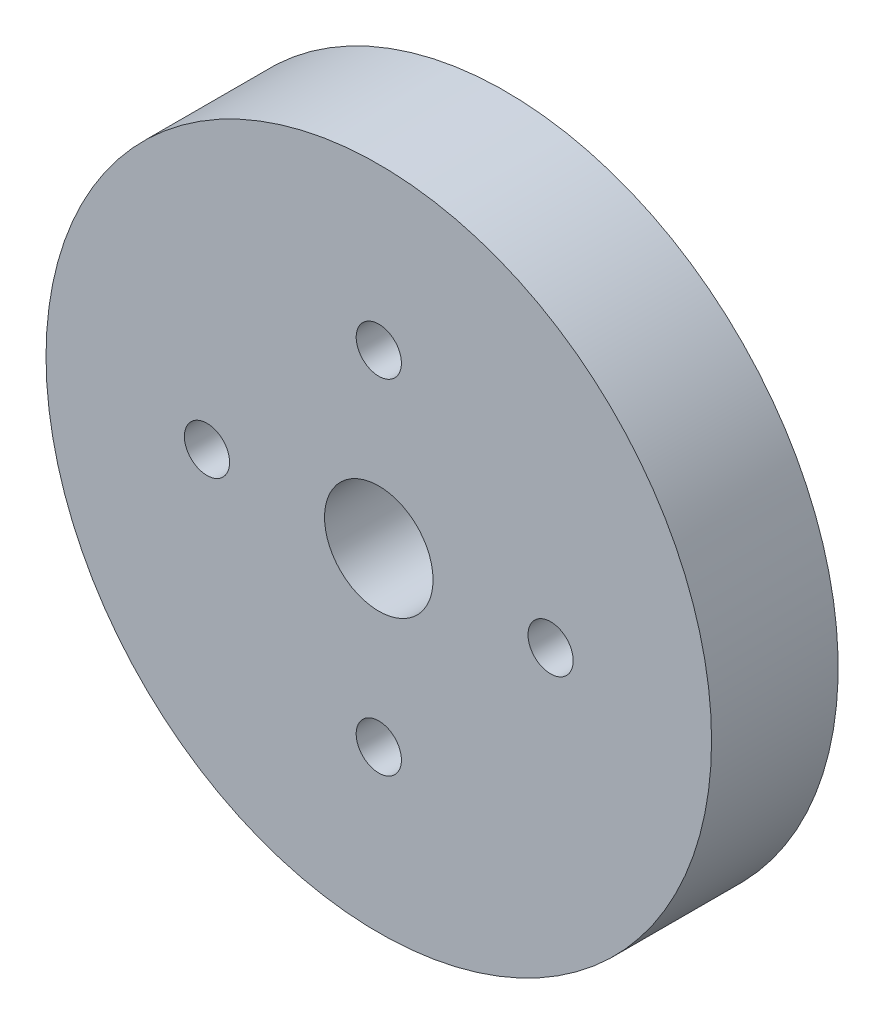
ISO-10303-21;
HEADER;
FILE_DESCRIPTION(('STEP AP214'),'2;1');
FILE_NAME('part.step','',(''),(''),'','','');
FILE_SCHEMA(('AUTOMOTIVE_DESIGN { 1 0 10303 214 1 1 1 1 }'));
ENDSEC;
DATA;
#1=APPLICATION_CONTEXT('core data for automotive mechanical design processes');
#2=APPLICATION_PROTOCOL_DEFINITION('international standard','automotive_design',2000,#1);
#3=PRODUCT_CONTEXT('',#1,'mechanical');
#4=PRODUCT('Part','Part','',(#3));
#5=PRODUCT_RELATED_PRODUCT_CATEGORY('part','',(#4));
#6=PRODUCT_DEFINITION_FORMATION('','',#4);
#7=PRODUCT_DEFINITION_CONTEXT('part definition',#1,'design');
#8=PRODUCT_DEFINITION('design','',#6,#7);
#9=PRODUCT_DEFINITION_SHAPE('','',#8);
#10=(LENGTH_UNIT() NAMED_UNIT(*) SI_UNIT(.MILLI.,.METRE.));
#11=(NAMED_UNIT(*) PLANE_ANGLE_UNIT() SI_UNIT($,.RADIAN.));
#12=(NAMED_UNIT(*) SI_UNIT($,.STERADIAN.) SOLID_ANGLE_UNIT());
#13=UNCERTAINTY_MEASURE_WITH_UNIT(LENGTH_MEASURE(1.E-05),#10,'distance_accuracy_value','');
#14=(GEOMETRIC_REPRESENTATION_CONTEXT(3) GLOBAL_UNCERTAINTY_ASSIGNED_CONTEXT((#13)) GLOBAL_UNIT_ASSIGNED_CONTEXT((#10,
#11,#12)) REPRESENTATION_CONTEXT('',''));
#15=CARTESIAN_POINT('',(0.,0.,0.));
#16=DIRECTION('',(0.,0.,1.));
#17=DIRECTION('',(1.,0.,0.));
#18=AXIS2_PLACEMENT_3D('',#15,#16,#17);
#19=CARTESIAN_POINT('',(0.,0.,26.3));
#20=DIRECTION('',(0.,0.,-1.));
#21=DIRECTION('',(-1.,0.,0.));
#22=AXIS2_PLACEMENT_3D('',#19,#20,#21);
#23=CYLINDRICAL_SURFACE('',#22,18.4);
#24=CARTESIAN_POINT('',(0.,0.,26.3));
#25=DIRECTION('',(0.,0.,1.));
#26=DIRECTION('',(1.,0.,0.));
#27=AXIS2_PLACEMENT_3D('',#24,#25,#26);
#28=CIRCLE('',#27,18.4);
#29=CARTESIAN_POINT('',(18.4,0.,26.3));
#30=VERTEX_POINT('',#29);
#31=EDGE_CURVE('E10',#30,#30,#28,.T.);
#32=ORIENTED_EDGE('',*,*,#31,.F.);
#33=EDGE_LOOP('',(#32));
#34=FACE_BOUND('',#33,.T.);
#35=CARTESIAN_POINT('',(0.,0.,19.3));
#36=DIRECTION('',(0.,0.,-1.));
#37=DIRECTION('',(-1.,0.,0.));
#38=AXIS2_PLACEMENT_3D('',#35,#36,#37);
#39=CIRCLE('',#38,18.4);
#40=CARTESIAN_POINT('',(-18.4,0.,19.3));
#41=VERTEX_POINT('',#40);
#42=EDGE_CURVE('E68',#41,#41,#39,.T.);
#43=ORIENTED_EDGE('',*,*,#42,.F.);
#44=EDGE_LOOP('',(#43));
#45=FACE_BOUND('',#44,.T.);
#46=ADVANCED_FACE('F35',(#34,#45),#23,.T.);
#47=CARTESIAN_POINT('',(0.,0.,26.3));
#48=DIRECTION('',(0.,0.,1.));
#49=DIRECTION('',(1.,0.,0.));
#50=AXIS2_PLACEMENT_3D('',#47,#48,#49);
#51=PLANE('',#50);
#52=CARTESIAN_POINT('',(0.,9.5,26.3));
#53=DIRECTION('',(0.,0.,1.));
#54=DIRECTION('',(1.,0.,0.));
#55=AXIS2_PLACEMENT_3D('',#52,#53,#54);
#56=CIRCLE('',#55,1.25);
#57=CARTESIAN_POINT('',(1.25,9.5,26.3));
#58=VERTEX_POINT('',#57);
#59=EDGE_CURVE('E59',#58,#58,#56,.T.);
#60=ORIENTED_EDGE('',*,*,#59,.F.);
#61=EDGE_LOOP('',(#60));
#62=FACE_BOUND('',#61,.T.);
#63=CARTESIAN_POINT('',(9.50000000000027,2.68842825129648E-13,26.3));
#64=DIRECTION('',(0.,0.,1.));
#65=DIRECTION('',(1.,0.,0.));
#66=AXIS2_PLACEMENT_3D('',#63,#64,#65);
#67=CIRCLE('',#66,1.25000000000021);
#68=CARTESIAN_POINT('',(10.7500000000005,2.68842825129648E-13,26.3));
#69=VERTEX_POINT('',#68);
#70=EDGE_CURVE('E52',#69,#69,#67,.T.);
#71=ORIENTED_EDGE('',*,*,#70,.F.);
#72=EDGE_LOOP('',(#71));
#73=FACE_BOUND('',#72,.T.);
#74=CARTESIAN_POINT('',(5.37685650259296E-13,-9.5,26.3));
#75=DIRECTION('',(0.,0.,1.));
#76=DIRECTION('',(1.,0.,0.));
#77=AXIS2_PLACEMENT_3D('',#74,#75,#76);
#78=CIRCLE('',#77,1.25000000000058);
#79=CARTESIAN_POINT('',(1.25000000000112,-9.5,26.3));
#80=VERTEX_POINT('',#79);
#81=EDGE_CURVE('E71',#80,#80,#78,.T.);
#82=ORIENTED_EDGE('',*,*,#81,.F.);
#83=EDGE_LOOP('',(#82));
#84=FACE_BOUND('',#83,.T.);
#85=CARTESIAN_POINT('',(-9.49999999999973,-2.70006239588838E-13,26.3));
#86=DIRECTION('',(0.,0.,1.));
#87=DIRECTION('',(1.,0.,0.));
#88=AXIS2_PLACEMENT_3D('',#85,#86,#87);
#89=CIRCLE('',#88,1.25000000000043);
#90=CARTESIAN_POINT('',(-8.2499999999993,-2.70006239588838E-13,26.3));
#91=VERTEX_POINT('',#90);
#92=EDGE_CURVE('E64',#91,#91,#89,.T.);
#93=ORIENTED_EDGE('',*,*,#92,.F.);
#94=EDGE_LOOP('',(#93));
#95=FACE_BOUND('',#94,.T.);
#96=CARTESIAN_POINT('',(0.,0.,26.3));
#97=DIRECTION('',(0.,0.,1.));
#98=DIRECTION('',(1.,0.,0.));
#99=AXIS2_PLACEMENT_3D('',#96,#97,#98);
#100=CIRCLE('',#99,3.);
#101=CARTESIAN_POINT('',(3.,0.,26.3));
#102=VERTEX_POINT('',#101);
#103=EDGE_CURVE('E45',#102,#102,#100,.T.);
#104=ORIENTED_EDGE('',*,*,#103,.F.);
#105=EDGE_LOOP('',(#104));
#106=FACE_BOUND('',#105,.T.);
#107=ORIENTED_EDGE('',*,*,#31,.T.);
#108=EDGE_LOOP('',(#107));
#109=FACE_BOUND('',#108,.T.);
#110=ADVANCED_FACE('F101',(#62,#73,#84,#95,#106,#109),#51,.T.);
#111=CARTESIAN_POINT('',(0.,0.,21.3));
#112=DIRECTION('',(0.,0.,1.));
#113=DIRECTION('',(1.,0.,0.));
#114=AXIS2_PLACEMENT_3D('',#111,#112,#113);
#115=CYLINDRICAL_SURFACE('',#114,3.);
#116=CARTESIAN_POINT('',(0.,0.,21.3));
#117=DIRECTION('',(0.,0.,1.));
#118=DIRECTION('',(1.,0.,0.));
#119=AXIS2_PLACEMENT_3D('',#116,#117,#118);
#120=CIRCLE('',#119,3.);
#121=CARTESIAN_POINT('',(3.,0.,21.3));
#122=VERTEX_POINT('',#121);
#123=EDGE_CURVE('E41',#122,#122,#120,.T.);
#124=ORIENTED_EDGE('',*,*,#123,.F.);
#125=EDGE_LOOP('',(#124));
#126=FACE_BOUND('',#125,.T.);
#127=ORIENTED_EDGE('',*,*,#103,.T.);
#128=EDGE_LOOP('',(#127));
#129=FACE_BOUND('',#128,.T.);
#130=ADVANCED_FACE('F106',(#126,#129),#115,.F.);
#131=CARTESIAN_POINT('',(0.,0.,21.3));
#132=DIRECTION('',(0.,0.,1.));
#133=DIRECTION('',(1.,0.,0.));
#134=AXIS2_PLACEMENT_3D('',#131,#132,#133);
#135=PLANE('',#134);
#136=ORIENTED_EDGE('',*,*,#123,.T.);
#137=EDGE_LOOP('',(#136));
#138=FACE_BOUND('',#137,.T.);
#139=ADVANCED_FACE('F111',(#138),#135,.T.);
#140=CARTESIAN_POINT('',(-9.49999999999973,-2.70006239588838E-13,21.3));
#141=DIRECTION('',(0.,0.,1.));
#142=DIRECTION('',(1.,0.,0.));
#143=AXIS2_PLACEMENT_3D('',#140,#141,#142);
#144=CYLINDRICAL_SURFACE('',#143,1.25000000000043);
#145=CARTESIAN_POINT('',(-9.49999999999973,-2.70006239588838E-13,21.3));
#146=DIRECTION('',(0.,0.,1.));
#147=DIRECTION('',(1.,0.,0.));
#148=AXIS2_PLACEMENT_3D('',#145,#146,#147);
#149=CIRCLE('',#148,1.25000000000043);
#150=CARTESIAN_POINT('',(-8.2499999999993,-2.70006239588838E-13,21.3));
#151=VERTEX_POINT('',#150);
#152=EDGE_CURVE('E67',#151,#151,#149,.T.);
#153=ORIENTED_EDGE('',*,*,#152,.F.);
#154=EDGE_LOOP('',(#153));
#155=FACE_BOUND('',#154,.T.);
#156=ORIENTED_EDGE('',*,*,#92,.T.);
#157=EDGE_LOOP('',(#156));
#158=FACE_BOUND('',#157,.T.);
#159=ADVANCED_FACE('F119',(#155,#158),#144,.F.);
#160=CARTESIAN_POINT('',(-9.49999999999973,-2.70006239588838E-13,21.3));
#161=DIRECTION('',(0.,0.,1.));
#162=DIRECTION('',(1.,0.,0.));
#163=AXIS2_PLACEMENT_3D('',#160,#161,#162);
#164=PLANE('',#163);
#165=ORIENTED_EDGE('',*,*,#152,.T.);
#166=EDGE_LOOP('',(#165));
#167=FACE_BOUND('',#166,.T.);
#168=ADVANCED_FACE('F138',(#167),#164,.T.);
#169=CARTESIAN_POINT('',(5.37685650259296E-13,-9.5,21.3));
#170=DIRECTION('',(0.,0.,1.));
#171=DIRECTION('',(1.,0.,0.));
#172=AXIS2_PLACEMENT_3D('',#169,#170,#171);
#173=CYLINDRICAL_SURFACE('',#172,1.25000000000058);
#174=CARTESIAN_POINT('',(5.37685650259296E-13,-9.5,21.3));
#175=DIRECTION('',(0.,0.,1.));
#176=DIRECTION('',(1.,0.,0.));
#177=AXIS2_PLACEMENT_3D('',#174,#175,#176);
#178=CIRCLE('',#177,1.25000000000058);
#179=CARTESIAN_POINT('',(1.25000000000112,-9.5,21.3));
#180=VERTEX_POINT('',#179);
#181=EDGE_CURVE('E56',#180,#180,#178,.T.);
#182=ORIENTED_EDGE('',*,*,#181,.F.);
#183=EDGE_LOOP('',(#182));
#184=FACE_BOUND('',#183,.T.);
#185=ORIENTED_EDGE('',*,*,#81,.T.);
#186=EDGE_LOOP('',(#185));
#187=FACE_BOUND('',#186,.T.);
#188=ADVANCED_FACE('F142',(#184,#187),#173,.F.);
#189=CARTESIAN_POINT('',(5.37685650259296E-13,-9.5,21.3));
#190=DIRECTION('',(0.,0.,1.));
#191=DIRECTION('',(1.,0.,0.));
#192=AXIS2_PLACEMENT_3D('',#189,#190,#191);
#193=PLANE('',#192);
#194=ORIENTED_EDGE('',*,*,#181,.T.);
#195=EDGE_LOOP('',(#194));
#196=FACE_BOUND('',#195,.T.);
#197=ADVANCED_FACE('F124',(#196),#193,.T.);
#198=CARTESIAN_POINT('',(9.50000000000027,2.68842825129648E-13,21.3));
#199=DIRECTION('',(0.,0.,1.));
#200=DIRECTION('',(1.,0.,0.));
#201=AXIS2_PLACEMENT_3D('',#198,#199,#200);
#202=CYLINDRICAL_SURFACE('',#201,1.25000000000021);
#203=CARTESIAN_POINT('',(9.50000000000027,2.68842825129648E-13,21.3));
#204=DIRECTION('',(0.,0.,1.));
#205=DIRECTION('',(1.,0.,0.));
#206=AXIS2_PLACEMENT_3D('',#203,#204,#205);
#207=CIRCLE('',#206,1.25000000000021);
#208=CARTESIAN_POINT('',(10.7500000000005,2.68842825129648E-13,21.3));
#209=VERTEX_POINT('',#208);
#210=EDGE_CURVE('E55',#209,#209,#207,.T.);
#211=ORIENTED_EDGE('',*,*,#210,.F.);
#212=EDGE_LOOP('',(#211));
#213=FACE_BOUND('',#212,.T.);
#214=ORIENTED_EDGE('',*,*,#70,.T.);
#215=EDGE_LOOP('',(#214));
#216=FACE_BOUND('',#215,.T.);
#217=ADVANCED_FACE('F120',(#213,#216),#202,.F.);
#218=CARTESIAN_POINT('',(9.50000000000027,2.68842825129648E-13,21.3));
#219=DIRECTION('',(0.,0.,1.));
#220=DIRECTION('',(1.,0.,0.));
#221=AXIS2_PLACEMENT_3D('',#218,#219,#220);
#222=PLANE('',#221);
#223=ORIENTED_EDGE('',*,*,#210,.T.);
#224=EDGE_LOOP('',(#223));
#225=FACE_BOUND('',#224,.T.);
#226=ADVANCED_FACE('F123',(#225),#222,.T.);
#227=CARTESIAN_POINT('',(0.,9.5,21.3));
#228=DIRECTION('',(0.,0.,1.));
#229=DIRECTION('',(1.,0.,0.));
#230=AXIS2_PLACEMENT_3D('',#227,#228,#229);
#231=CYLINDRICAL_SURFACE('',#230,1.25);
#232=CARTESIAN_POINT('',(0.,9.5,21.3));
#233=DIRECTION('',(0.,0.,1.));
#234=DIRECTION('',(1.,0.,0.));
#235=AXIS2_PLACEMENT_3D('',#232,#233,#234);
#236=CIRCLE('',#235,1.25);
#237=CARTESIAN_POINT('',(1.25,9.5,21.3));
#238=VERTEX_POINT('',#237);
#239=EDGE_CURVE('E50',#238,#238,#236,.T.);
#240=ORIENTED_EDGE('',*,*,#239,.F.);
#241=EDGE_LOOP('',(#240));
#242=FACE_BOUND('',#241,.T.);
#243=ORIENTED_EDGE('',*,*,#59,.T.);
#244=EDGE_LOOP('',(#243));
#245=FACE_BOUND('',#244,.T.);
#246=ADVANCED_FACE('F128',(#242,#245),#231,.F.);
#247=CARTESIAN_POINT('',(0.,9.5,21.3));
#248=DIRECTION('',(0.,0.,1.));
#249=DIRECTION('',(1.,0.,0.));
#250=AXIS2_PLACEMENT_3D('',#247,#248,#249);
#251=PLANE('',#250);
#252=ORIENTED_EDGE('',*,*,#239,.T.);
#253=EDGE_LOOP('',(#252));
#254=FACE_BOUND('',#253,.T.);
#255=ADVANCED_FACE('F96',(#254),#251,.T.);
#256=CARTESIAN_POINT('',(0.,0.,19.3));
#257=DIRECTION('',(0.,0.,-1.));
#258=DIRECTION('',(-1.,0.,0.));
#259=AXIS2_PLACEMENT_3D('',#256,#257,#258);
#260=PLANE('',#259);
#261=CARTESIAN_POINT('',(0.,0.,19.3));
#262=DIRECTION('',(0.,0.,-1.));
#263=DIRECTION('',(-1.,0.,0.));
#264=AXIS2_PLACEMENT_3D('',#261,#262,#263);
#265=CIRCLE('',#264,6.);
#266=CARTESIAN_POINT('',(-6.,0.,19.3));
#267=VERTEX_POINT('',#266);
#268=EDGE_CURVE('E79',#267,#267,#265,.T.);
#269=ORIENTED_EDGE('',*,*,#268,.F.);
#270=EDGE_LOOP('',(#269));
#271=FACE_BOUND('',#270,.T.);
#272=ORIENTED_EDGE('',*,*,#42,.T.);
#273=EDGE_LOOP('',(#272));
#274=FACE_BOUND('',#273,.T.);
#275=ADVANCED_FACE('F90',(#271,#274),#260,.T.);
#276=CARTESIAN_POINT('',(0.,0.,20.3));
#277=DIRECTION('',(0.,0.,-1.));
#278=DIRECTION('',(-1.,0.,0.));
#279=AXIS2_PLACEMENT_3D('',#276,#277,#278);
#280=CYLINDRICAL_SURFACE('',#279,6.);
#281=CARTESIAN_POINT('',(0.,0.,20.3));
#282=DIRECTION('',(0.,0.,-1.));
#283=DIRECTION('',(-1.,0.,0.));
#284=AXIS2_PLACEMENT_3D('',#281,#282,#283);
#285=CIRCLE('',#284,6.);
#286=CARTESIAN_POINT('',(-6.,0.,20.3));
#287=VERTEX_POINT('',#286);
#288=EDGE_CURVE('E78',#287,#287,#285,.T.);
#289=ORIENTED_EDGE('',*,*,#288,.F.);
#290=EDGE_LOOP('',(#289));
#291=FACE_BOUND('',#290,.T.);
#292=ORIENTED_EDGE('',*,*,#268,.T.);
#293=EDGE_LOOP('',(#292));
#294=FACE_BOUND('',#293,.T.);
#295=ADVANCED_FACE('F87',(#291,#294),#280,.F.);
#296=CARTESIAN_POINT('',(0.,0.,20.3));
#297=DIRECTION('',(0.,0.,-1.));
#298=DIRECTION('',(-1.,0.,0.));
#299=AXIS2_PLACEMENT_3D('',#296,#297,#298);
#300=PLANE('',#299);
#301=ORIENTED_EDGE('',*,*,#288,.T.);
#302=EDGE_LOOP('',(#301));
#303=FACE_BOUND('',#302,.T.);
#304=ADVANCED_FACE('F85',(#303),#300,.T.);
#305=CLOSED_SHELL('',(#46,#110,#130,#139,#159,#168,#188,#197,#217,#226,#246,#255,#275,#295,#304));
#306=MANIFOLD_SOLID_BREP('B2',#305);
#307=ADVANCED_BREP_SHAPE_REPRESENTATION('',(#18,#306),#14);
#308=SHAPE_DEFINITION_REPRESENTATION(#9,#307);
ENDSEC;
END-ISO-10303-21;
